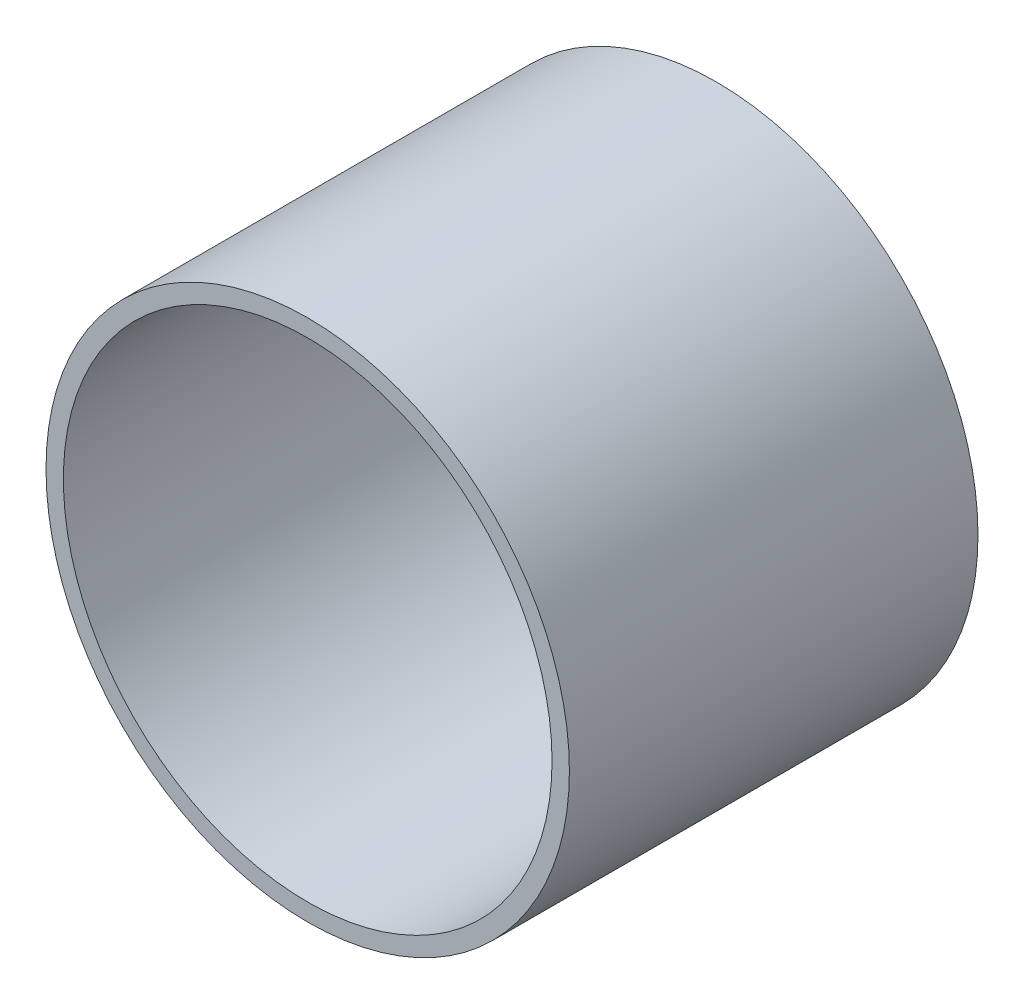
ISO-10303-21;
HEADER;
FILE_DESCRIPTION(('STEP AP214'),'2;1');
FILE_NAME('part.step','',(''),(''),'','','');
FILE_SCHEMA(('AUTOMOTIVE_DESIGN { 1 0 10303 214 1 1 1 1 }'));
ENDSEC;
DATA;
#1=APPLICATION_CONTEXT('core data for automotive mechanical design processes');
#2=APPLICATION_PROTOCOL_DEFINITION('international standard','automotive_design',2000,#1);
#3=PRODUCT_CONTEXT('',#1,'mechanical');
#4=PRODUCT('Part','Part','',(#3));
#5=PRODUCT_RELATED_PRODUCT_CATEGORY('part','',(#4));
#6=PRODUCT_DEFINITION_FORMATION('','',#4);
#7=PRODUCT_DEFINITION_CONTEXT('part definition',#1,'design');
#8=PRODUCT_DEFINITION('design','',#6,#7);
#9=PRODUCT_DEFINITION_SHAPE('','',#8);
#10=(LENGTH_UNIT() NAMED_UNIT(*) SI_UNIT(.MILLI.,.METRE.));
#11=(NAMED_UNIT(*) PLANE_ANGLE_UNIT() SI_UNIT($,.RADIAN.));
#12=(NAMED_UNIT(*) SI_UNIT($,.STERADIAN.) SOLID_ANGLE_UNIT());
#13=UNCERTAINTY_MEASURE_WITH_UNIT(LENGTH_MEASURE(1.E-05),#10,'distance_accuracy_value','');
#14=(GEOMETRIC_REPRESENTATION_CONTEXT(3) GLOBAL_UNCERTAINTY_ASSIGNED_CONTEXT((#13)) GLOBAL_UNIT_ASSIGNED_CONTEXT((#10,
#11,#12)) REPRESENTATION_CONTEXT('',''));
#15=CARTESIAN_POINT('',(0.,0.,0.));
#16=DIRECTION('',(0.,0.,1.));
#17=DIRECTION('',(1.,0.,0.));
#18=AXIS2_PLACEMENT_3D('',#15,#16,#17);
#19=CARTESIAN_POINT('',(0.,0.,50.8));
#20=DIRECTION('',(0.,0.,1.));
#21=DIRECTION('',(1.,0.,0.));
#22=AXIS2_PLACEMENT_3D('',#19,#20,#21);
#23=PLANE('',#22);
#24=CARTESIAN_POINT('',(0.,0.,50.8));
#25=DIRECTION('',(0.,0.,1.));
#26=DIRECTION('',(1.,0.,0.));
#27=AXIS2_PLACEMENT_3D('',#24,#25,#26);
#28=CIRCLE('',#27,32.5374);
#29=CARTESIAN_POINT('',(32.5374,0.,50.8));
#30=VERTEX_POINT('',#29);
#31=EDGE_CURVE('E10',#30,#30,#28,.T.);
#32=ORIENTED_EDGE('',*,*,#31,.T.);
#33=EDGE_LOOP('',(#32));
#34=FACE_BOUND('',#33,.T.);
#35=CARTESIAN_POINT('',(0.,0.,50.8));
#36=DIRECTION('',(0.,0.,1.));
#37=DIRECTION('',(1.,0.,0.));
#38=AXIS2_PLACEMENT_3D('',#35,#36,#37);
#39=CIRCLE('',#38,30.3784);
#40=CARTESIAN_POINT('',(30.3784,0.,50.8));
#41=VERTEX_POINT('',#40);
#42=EDGE_CURVE('E42',#41,#41,#39,.T.);
#43=ORIENTED_EDGE('',*,*,#42,.F.);
#44=EDGE_LOOP('',(#43));
#45=FACE_BOUND('',#44,.T.);
#46=ADVANCED_FACE('F31',(#34,#45),#23,.T.);
#47=CARTESIAN_POINT('',(0.,0.,0.));
#48=DIRECTION('',(0.,0.,1.));
#49=DIRECTION('',(1.,0.,0.));
#50=AXIS2_PLACEMENT_3D('',#47,#48,#49);
#51=PLANE('',#50);
#52=CARTESIAN_POINT('',(0.,0.,0.));
#53=DIRECTION('',(0.,0.,1.));
#54=DIRECTION('',(1.,0.,0.));
#55=AXIS2_PLACEMENT_3D('',#52,#53,#54);
#56=CIRCLE('',#55,32.5374);
#57=CARTESIAN_POINT('',(32.5374,0.,0.));
#58=VERTEX_POINT('',#57);
#59=EDGE_CURVE('E35',#58,#58,#56,.T.);
#60=ORIENTED_EDGE('',*,*,#59,.F.);
#61=EDGE_LOOP('',(#60));
#62=FACE_BOUND('',#61,.T.);
#63=CARTESIAN_POINT('',(0.,0.,0.));
#64=DIRECTION('',(0.,0.,1.));
#65=DIRECTION('',(1.,0.,0.));
#66=AXIS2_PLACEMENT_3D('',#63,#64,#65);
#67=CIRCLE('',#66,30.3784);
#68=CARTESIAN_POINT('',(30.3784,0.,0.));
#69=VERTEX_POINT('',#68);
#70=EDGE_CURVE('E44',#69,#69,#67,.T.);
#71=ORIENTED_EDGE('',*,*,#70,.T.);
#72=EDGE_LOOP('',(#71));
#73=FACE_BOUND('',#72,.T.);
#74=ADVANCED_FACE('F54',(#62,#73),#51,.F.);
#75=CARTESIAN_POINT('',(0.,0.,50.8));
#76=DIRECTION('',(0.,0.,-1.));
#77=DIRECTION('',(-1.,0.,0.));
#78=AXIS2_PLACEMENT_3D('',#75,#76,#77);
#79=CYLINDRICAL_SURFACE('',#78,32.5374);
#80=ORIENTED_EDGE('',*,*,#31,.F.);
#81=EDGE_LOOP('',(#80));
#82=FACE_BOUND('',#81,.T.);
#83=ORIENTED_EDGE('',*,*,#59,.T.);
#84=EDGE_LOOP('',(#83));
#85=FACE_BOUND('',#84,.T.);
#86=ADVANCED_FACE('F33',(#82,#85),#79,.T.);
#87=CARTESIAN_POINT('',(0.,0.,50.8));
#88=DIRECTION('',(0.,0.,-1.));
#89=DIRECTION('',(-1.,0.,0.));
#90=AXIS2_PLACEMENT_3D('',#87,#88,#89);
#91=CYLINDRICAL_SURFACE('',#90,30.3784);
#92=ORIENTED_EDGE('',*,*,#42,.T.);
#93=EDGE_LOOP('',(#92));
#94=FACE_BOUND('',#93,.T.);
#95=ORIENTED_EDGE('',*,*,#70,.F.);
#96=EDGE_LOOP('',(#95));
#97=FACE_BOUND('',#96,.T.);
#98=ADVANCED_FACE('F50',(#94,#97),#91,.F.);
#99=CLOSED_SHELL('',(#46,#74,#86,#98));
#100=MANIFOLD_SOLID_BREP('B2',#99);
#101=ADVANCED_BREP_SHAPE_REPRESENTATION('',(#18,#100),#14);
#102=SHAPE_DEFINITION_REPRESENTATION(#9,#101);
ENDSEC;
END-ISO-10303-21;
